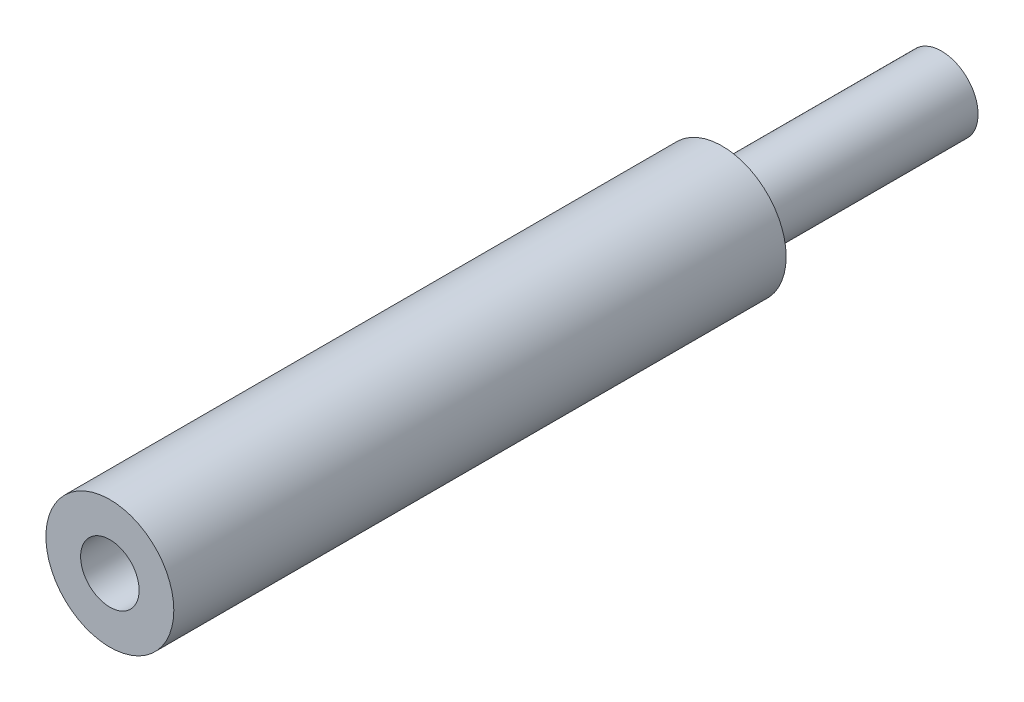
ISO-10303-21;
HEADER;
FILE_DESCRIPTION(('STEP AP214'),'2;1');
FILE_NAME('part.step','',(''),(''),'','','');
FILE_SCHEMA(('AUTOMOTIVE_DESIGN { 1 0 10303 214 1 1 1 1 }'));
ENDSEC;
DATA;
#1=APPLICATION_CONTEXT('core data for automotive mechanical design processes');
#2=APPLICATION_PROTOCOL_DEFINITION('international standard','automotive_design',2000,#1);
#3=PRODUCT_CONTEXT('',#1,'mechanical');
#4=PRODUCT('Part','Part','',(#3));
#5=PRODUCT_RELATED_PRODUCT_CATEGORY('part','',(#4));
#6=PRODUCT_DEFINITION_FORMATION('','',#4);
#7=PRODUCT_DEFINITION_CONTEXT('part definition',#1,'design');
#8=PRODUCT_DEFINITION('design','',#6,#7);
#9=PRODUCT_DEFINITION_SHAPE('','',#8);
#10=(LENGTH_UNIT() NAMED_UNIT(*) SI_UNIT(.MILLI.,.METRE.));
#11=(NAMED_UNIT(*) PLANE_ANGLE_UNIT() SI_UNIT($,.RADIAN.));
#12=(NAMED_UNIT(*) SI_UNIT($,.STERADIAN.) SOLID_ANGLE_UNIT());
#13=UNCERTAINTY_MEASURE_WITH_UNIT(LENGTH_MEASURE(1.E-05),#10,'distance_accuracy_value','');
#14=(GEOMETRIC_REPRESENTATION_CONTEXT(3) GLOBAL_UNCERTAINTY_ASSIGNED_CONTEXT((#13)) GLOBAL_UNIT_ASSIGNED_CONTEXT((#10,
#11,#12)) REPRESENTATION_CONTEXT('',''));
#15=CARTESIAN_POINT('',(0.,0.,0.));
#16=DIRECTION('',(0.,0.,1.));
#17=DIRECTION('',(1.,0.,0.));
#18=AXIS2_PLACEMENT_3D('',#15,#16,#17);
#19=CARTESIAN_POINT('',(0.,0.,33.5));
#20=DIRECTION('',(0.,0.,-1.));
#21=DIRECTION('',(-1.,0.,0.));
#22=AXIS2_PLACEMENT_3D('',#19,#20,#21);
#23=CYLINDRICAL_SURFACE('',#22,3.5);
#24=CARTESIAN_POINT('',(0.,0.,33.5));
#25=DIRECTION('',(0.,0.,1.));
#26=DIRECTION('',(1.,0.,0.));
#27=AXIS2_PLACEMENT_3D('',#24,#25,#26);
#28=CIRCLE('',#27,3.5);
#29=CARTESIAN_POINT('',(3.5,0.,33.5));
#30=VERTEX_POINT('',#29);
#31=EDGE_CURVE('E48',#30,#30,#28,.T.);
#32=ORIENTED_EDGE('',*,*,#31,.F.);
#33=EDGE_LOOP('',(#32));
#34=FACE_BOUND('',#33,.T.);
#35=CARTESIAN_POINT('',(0.,0.,0.));
#36=DIRECTION('',(0.,0.,1.));
#37=DIRECTION('',(1.,0.,0.));
#38=AXIS2_PLACEMENT_3D('',#35,#36,#37);
#39=CIRCLE('',#38,3.5);
#40=CARTESIAN_POINT('',(3.5,0.,0.));
#41=VERTEX_POINT('',#40);
#42=EDGE_CURVE('E44',#41,#41,#39,.T.);
#43=ORIENTED_EDGE('',*,*,#42,.T.);
#44=EDGE_LOOP('',(#43));
#45=FACE_BOUND('',#44,.T.);
#46=ADVANCED_FACE('F41',(#34,#45),#23,.T.);
#47=CARTESIAN_POINT('',(0.,0.,33.5));
#48=DIRECTION('',(0.,0.,1.));
#49=DIRECTION('',(1.,0.,0.));
#50=AXIS2_PLACEMENT_3D('',#47,#48,#49);
#51=PLANE('',#50);
#52=CARTESIAN_POINT('',(0.,0.,33.5));
#53=DIRECTION('',(0.,0.,1.));
#54=DIRECTION('',(1.,0.,0.));
#55=AXIS2_PLACEMENT_3D('',#52,#53,#54);
#56=CIRCLE('',#55,1.6);
#57=CARTESIAN_POINT('',(1.6,0.,33.5));
#58=VERTEX_POINT('',#57);
#59=EDGE_CURVE('E63',#58,#58,#56,.T.);
#60=ORIENTED_EDGE('',*,*,#59,.F.);
#61=EDGE_LOOP('',(#60));
#62=FACE_BOUND('',#61,.T.);
#63=ORIENTED_EDGE('',*,*,#31,.T.);
#64=EDGE_LOOP('',(#63));
#65=FACE_BOUND('',#64,.T.);
#66=ADVANCED_FACE('F79',(#62,#65),#51,.T.);
#67=CARTESIAN_POINT('',(0.,0.,0.));
#68=DIRECTION('',(0.,0.,1.));
#69=DIRECTION('',(1.,0.,0.));
#70=AXIS2_PLACEMENT_3D('',#67,#68,#69);
#71=PLANE('',#70);
#72=CARTESIAN_POINT('',(0.,0.,0.));
#73=DIRECTION('',(0.,0.,-1.));
#74=DIRECTION('',(-1.,0.,0.));
#75=AXIS2_PLACEMENT_3D('',#72,#73,#74);
#76=CIRCLE('',#75,2.);
#77=CARTESIAN_POINT('',(-2.,0.,0.));
#78=VERTEX_POINT('',#77);
#79=EDGE_CURVE('E11',#78,#78,#76,.T.);
#80=ORIENTED_EDGE('',*,*,#79,.F.);
#81=EDGE_LOOP('',(#80));
#82=FACE_BOUND('',#81,.T.);
#83=ORIENTED_EDGE('',*,*,#42,.F.);
#84=EDGE_LOOP('',(#83));
#85=FACE_BOUND('',#84,.T.);
#86=ADVANCED_FACE('F76',(#82,#85),#71,.F.);
#87=CARTESIAN_POINT('',(0.,0.,-12.));
#88=DIRECTION('',(0.,0.,1.));
#89=DIRECTION('',(1.,0.,0.));
#90=AXIS2_PLACEMENT_3D('',#87,#88,#89);
#91=CYLINDRICAL_SURFACE('',#90,2.);
#92=CARTESIAN_POINT('',(0.,0.,-12.));
#93=DIRECTION('',(0.,0.,-1.));
#94=DIRECTION('',(-1.,0.,0.));
#95=AXIS2_PLACEMENT_3D('',#92,#93,#94);
#96=CIRCLE('',#95,2.);
#97=CARTESIAN_POINT('',(-2.,0.,-12.));
#98=VERTEX_POINT('',#97);
#99=EDGE_CURVE('E62',#98,#98,#96,.T.);
#100=ORIENTED_EDGE('',*,*,#99,.F.);
#101=EDGE_LOOP('',(#100));
#102=FACE_BOUND('',#101,.T.);
#103=ORIENTED_EDGE('',*,*,#79,.T.);
#104=EDGE_LOOP('',(#103));
#105=FACE_BOUND('',#104,.T.);
#106=ADVANCED_FACE('F78',(#102,#105),#91,.T.);
#107=CARTESIAN_POINT('',(0.,0.,-12.));
#108=DIRECTION('',(0.,0.,-1.));
#109=DIRECTION('',(-1.,0.,0.));
#110=AXIS2_PLACEMENT_3D('',#107,#108,#109);
#111=PLANE('',#110);
#112=ORIENTED_EDGE('',*,*,#99,.T.);
#113=EDGE_LOOP('',(#112));
#114=FACE_BOUND('',#113,.T.);
#115=ADVANCED_FACE('F56',(#114),#111,.T.);
#116=CARTESIAN_POINT('',(0.,0.,19.5));
#117=DIRECTION('',(0.,0.,1.));
#118=DIRECTION('',(1.,0.,0.));
#119=AXIS2_PLACEMENT_3D('',#116,#117,#118);
#120=CONICAL_SURFACE('',#119,1.6,1.02974425867665);
#121=CARTESIAN_POINT('',(0.,0.,18.5386230095559));
#122=VERTEX_POINT('',#121);
#123=VERTEX_LOOP('',#122);
#124=FACE_BOUND('',#123,.T.);
#125=CARTESIAN_POINT('',(0.,0.,19.5));
#126=DIRECTION('',(0.,0.,1.));
#127=DIRECTION('',(1.,0.,0.));
#128=AXIS2_PLACEMENT_3D('',#125,#126,#127);
#129=CIRCLE('',#128,1.6);
#130=CARTESIAN_POINT('',(1.6,0.,19.5));
#131=VERTEX_POINT('',#130);
#132=EDGE_CURVE('E60',#131,#131,#129,.T.);
#133=ORIENTED_EDGE('',*,*,#132,.T.);
#134=EDGE_LOOP('',(#133));
#135=FACE_BOUND('',#134,.T.);
#136=ADVANCED_FACE('F52',(#124,#135),#120,.F.);
#137=CARTESIAN_POINT('',(0.,0.,33.5));
#138=DIRECTION('',(0.,0.,1.));
#139=DIRECTION('',(1.,0.,0.));
#140=AXIS2_PLACEMENT_3D('',#137,#138,#139);
#141=CYLINDRICAL_SURFACE('',#140,1.6);
#142=ORIENTED_EDGE('',*,*,#132,.F.);
#143=EDGE_LOOP('',(#142));
#144=FACE_BOUND('',#143,.T.);
#145=ORIENTED_EDGE('',*,*,#59,.T.);
#146=EDGE_LOOP('',(#145));
#147=FACE_BOUND('',#146,.T.);
#148=ADVANCED_FACE('F55',(#144,#147),#141,.F.);
#149=CLOSED_SHELL('',(#46,#66,#86,#106,#115,#136,#148));
#150=MANIFOLD_SOLID_BREP('B2',#149);
#151=ADVANCED_BREP_SHAPE_REPRESENTATION('',(#18,#150),#14);
#152=SHAPE_DEFINITION_REPRESENTATION(#9,#151);
ENDSEC;
END-ISO-10303-21;
